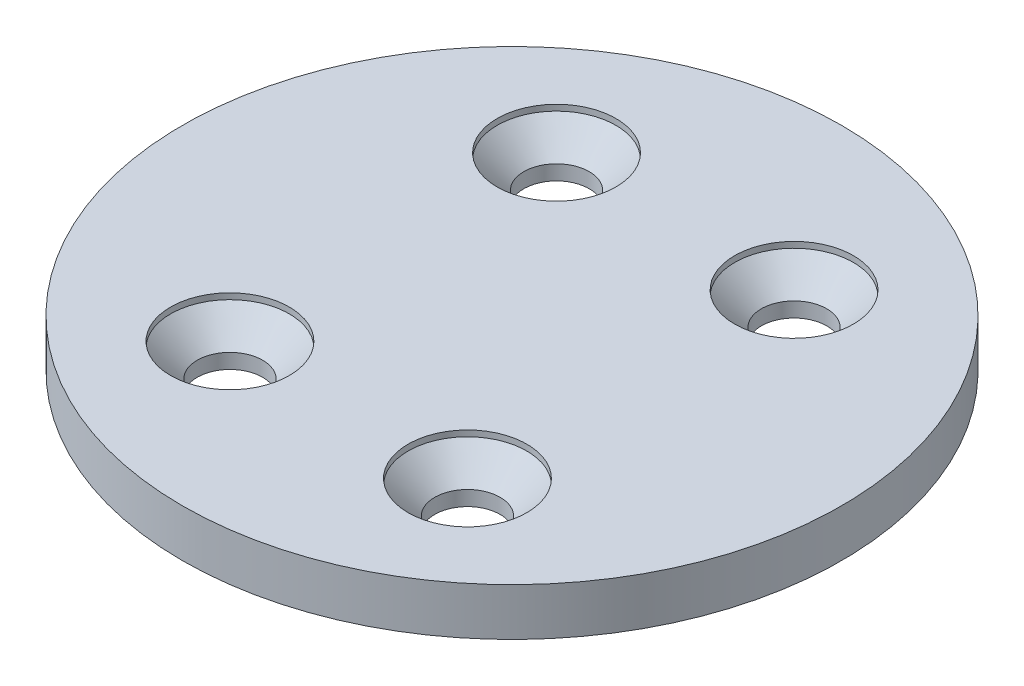
ISO-10303-21;
HEADER;
FILE_DESCRIPTION(('STEP AP214'),'2;1');
FILE_NAME('part.step','',(''),(''),'','','');
FILE_SCHEMA(('AUTOMOTIVE_DESIGN { 1 0 10303 214 1 1 1 1 }'));
ENDSEC;
DATA;
#1=APPLICATION_CONTEXT('core data for automotive mechanical design processes');
#2=APPLICATION_PROTOCOL_DEFINITION('international standard','automotive_design',2000,#1);
#3=PRODUCT_CONTEXT('',#1,'mechanical');
#4=PRODUCT('Part','Part','',(#3));
#5=PRODUCT_RELATED_PRODUCT_CATEGORY('part','',(#4));
#6=PRODUCT_DEFINITION_FORMATION('','',#4);
#7=PRODUCT_DEFINITION_CONTEXT('part definition',#1,'design');
#8=PRODUCT_DEFINITION('design','',#6,#7);
#9=PRODUCT_DEFINITION_SHAPE('','',#8);
#10=(LENGTH_UNIT() NAMED_UNIT(*) SI_UNIT(.MILLI.,.METRE.));
#11=(NAMED_UNIT(*) PLANE_ANGLE_UNIT() SI_UNIT($,.RADIAN.));
#12=(NAMED_UNIT(*) SI_UNIT($,.STERADIAN.) SOLID_ANGLE_UNIT());
#13=UNCERTAINTY_MEASURE_WITH_UNIT(LENGTH_MEASURE(1.E-05),#10,'distance_accuracy_value','');
#14=(GEOMETRIC_REPRESENTATION_CONTEXT(3) GLOBAL_UNCERTAINTY_ASSIGNED_CONTEXT((#13)) GLOBAL_UNIT_ASSIGNED_CONTEXT((#10,
#11,#12)) REPRESENTATION_CONTEXT('',''));
#15=CARTESIAN_POINT('',(0.,0.,0.));
#16=DIRECTION('',(0.,0.,1.));
#17=DIRECTION('',(1.,0.,0.));
#18=AXIS2_PLACEMENT_3D('',#15,#16,#17);
#19=CARTESIAN_POINT('',(10.,4.,-13.75));
#20=DIRECTION('',(0.,-1.,0.));
#21=DIRECTION('',(0.,0.,-1.));
#22=AXIS2_PLACEMENT_3D('',#19,#20,#21);
#23=CYLINDRICAL_SURFACE('',#22,2.75);
#24=CARTESIAN_POINT('',(10.,0.,-13.75));
#25=DIRECTION('',(0.,1.,0.));
#26=DIRECTION('',(0.,0.,1.));
#27=AXIS2_PLACEMENT_3D('',#24,#25,#26);
#28=CIRCLE('',#27,2.75);
#29=CARTESIAN_POINT('',(10.,0.,-11.));
#30=VERTEX_POINT('',#29);
#31=EDGE_CURVE('E175',#30,#30,#28,.T.);
#32=ORIENTED_EDGE('',*,*,#31,.F.);
#33=EDGE_LOOP('',(#32));
#34=FACE_BOUND('',#33,.T.);
#35=CARTESIAN_POINT('',(10.,1.25,-13.75));
#36=DIRECTION('',(0.,1.,0.));
#37=DIRECTION('',(0.,0.,1.));
#38=AXIS2_PLACEMENT_3D('',#35,#36,#37);
#39=CIRCLE('',#38,2.75);
#40=CARTESIAN_POINT('',(10.,1.25,-11.));
#41=VERTEX_POINT('',#40);
#42=EDGE_CURVE('E104',#41,#41,#39,.T.);
#43=ORIENTED_EDGE('',*,*,#42,.T.);
#44=EDGE_LOOP('',(#43));
#45=FACE_BOUND('',#44,.T.);
#46=ADVANCED_FACE('F41',(#34,#45),#23,.F.);
#47=CARTESIAN_POINT('',(10.,4.,13.75));
#48=DIRECTION('',(0.,-1.,0.));
#49=DIRECTION('',(0.,0.,-1.));
#50=AXIS2_PLACEMENT_3D('',#47,#48,#49);
#51=CYLINDRICAL_SURFACE('',#50,2.74999999999999);
#52=CARTESIAN_POINT('',(10.,0.,13.75));
#53=DIRECTION('',(0.,1.,0.));
#54=DIRECTION('',(0.,0.,1.));
#55=AXIS2_PLACEMENT_3D('',#52,#53,#54);
#56=CIRCLE('',#55,2.74999999999999);
#57=CARTESIAN_POINT('',(10.,0.,16.5));
#58=VERTEX_POINT('',#57);
#59=EDGE_CURVE('E57',#58,#58,#56,.T.);
#60=ORIENTED_EDGE('',*,*,#59,.F.);
#61=EDGE_LOOP('',(#60));
#62=FACE_BOUND('',#61,.T.);
#63=CARTESIAN_POINT('',(10.,1.25,13.75));
#64=DIRECTION('',(0.,1.,0.));
#65=DIRECTION('',(0.,0.,1.));
#66=AXIS2_PLACEMENT_3D('',#63,#64,#65);
#67=CIRCLE('',#66,2.75);
#68=CARTESIAN_POINT('',(10.,1.25,16.5));
#69=VERTEX_POINT('',#68);
#70=EDGE_CURVE('E92',#69,#69,#67,.T.);
#71=ORIENTED_EDGE('',*,*,#70,.T.);
#72=EDGE_LOOP('',(#71));
#73=FACE_BOUND('',#72,.T.);
#74=ADVANCED_FACE('F148',(#62,#73),#51,.F.);
#75=CARTESIAN_POINT('',(-10.,4.,-13.75));
#76=DIRECTION('',(0.,-1.,0.));
#77=DIRECTION('',(0.,0.,-1.));
#78=AXIS2_PLACEMENT_3D('',#75,#76,#77);
#79=CYLINDRICAL_SURFACE('',#78,2.75000000000001);
#80=CARTESIAN_POINT('',(-10.,0.,-13.75));
#81=DIRECTION('',(0.,1.,0.));
#82=DIRECTION('',(0.,0.,1.));
#83=AXIS2_PLACEMENT_3D('',#80,#81,#82);
#84=CIRCLE('',#83,2.75000000000001);
#85=CARTESIAN_POINT('',(-10.,0.,-11.));
#86=VERTEX_POINT('',#85);
#87=EDGE_CURVE('E64',#86,#86,#84,.T.);
#88=ORIENTED_EDGE('',*,*,#87,.F.);
#89=EDGE_LOOP('',(#88));
#90=FACE_BOUND('',#89,.T.);
#91=CARTESIAN_POINT('',(-10.,1.25,-13.75));
#92=DIRECTION('',(0.,1.,0.));
#93=DIRECTION('',(0.,0.,1.));
#94=AXIS2_PLACEMENT_3D('',#91,#92,#93);
#95=CIRCLE('',#94,2.75);
#96=CARTESIAN_POINT('',(-10.,1.25,-11.));
#97=VERTEX_POINT('',#96);
#98=EDGE_CURVE('E61',#97,#97,#95,.T.);
#99=ORIENTED_EDGE('',*,*,#98,.T.);
#100=EDGE_LOOP('',(#99));
#101=FACE_BOUND('',#100,.T.);
#102=ADVANCED_FACE('F43',(#90,#101),#79,.F.);
#103=CARTESIAN_POINT('',(-10.,4.,13.75));
#104=DIRECTION('',(0.,-1.,0.));
#105=DIRECTION('',(0.,0.,-1.));
#106=AXIS2_PLACEMENT_3D('',#103,#104,#105);
#107=CYLINDRICAL_SURFACE('',#106,2.75);
#108=CARTESIAN_POINT('',(-10.,1.25,13.75));
#109=DIRECTION('',(0.,1.,0.));
#110=DIRECTION('',(0.,0.,1.));
#111=AXIS2_PLACEMENT_3D('',#108,#109,#110);
#112=CIRCLE('',#111,2.75);
#113=CARTESIAN_POINT('',(-10.,1.25,16.5));
#114=VERTEX_POINT('',#113);
#115=EDGE_CURVE('E79',#114,#114,#112,.T.);
#116=ORIENTED_EDGE('',*,*,#115,.T.);
#117=EDGE_LOOP('',(#116));
#118=FACE_BOUND('',#117,.T.);
#119=CARTESIAN_POINT('',(-10.,0.,13.75));
#120=DIRECTION('',(0.,1.,0.));
#121=DIRECTION('',(0.,0.,1.));
#122=AXIS2_PLACEMENT_3D('',#119,#120,#121);
#123=CIRCLE('',#122,2.75);
#124=CARTESIAN_POINT('',(-10.,0.,16.5));
#125=VERTEX_POINT('',#124);
#126=EDGE_CURVE('E172',#125,#125,#123,.T.);
#127=ORIENTED_EDGE('',*,*,#126,.F.);
#128=EDGE_LOOP('',(#127));
#129=FACE_BOUND('',#128,.T.);
#130=ADVANCED_FACE('F159',(#118,#129),#107,.F.);
#131=CARTESIAN_POINT('',(0.,4.,0.));
#132=DIRECTION('',(0.,-1.,0.));
#133=DIRECTION('',(0.,0.,-1.));
#134=AXIS2_PLACEMENT_3D('',#131,#132,#133);
#135=CYLINDRICAL_SURFACE('',#134,27.75);
#136=CARTESIAN_POINT('',(0.,4.,0.));
#137=DIRECTION('',(0.,1.,0.));
#138=DIRECTION('',(0.,0.,1.));
#139=AXIS2_PLACEMENT_3D('',#136,#137,#138);
#140=CIRCLE('',#139,27.75);
#141=CARTESIAN_POINT('',(0.,4.,27.75));
#142=VERTEX_POINT('',#141);
#143=EDGE_CURVE('E11',#142,#142,#140,.T.);
#144=ORIENTED_EDGE('',*,*,#143,.F.);
#145=EDGE_LOOP('',(#144));
#146=FACE_BOUND('',#145,.T.);
#147=CARTESIAN_POINT('',(0.,0.,0.));
#148=DIRECTION('',(0.,1.,0.));
#149=DIRECTION('',(0.,0.,1.));
#150=AXIS2_PLACEMENT_3D('',#147,#148,#149);
#151=CIRCLE('',#150,27.75);
#152=CARTESIAN_POINT('',(0.,0.,27.75));
#153=VERTEX_POINT('',#152);
#154=EDGE_CURVE('E45',#153,#153,#151,.T.);
#155=ORIENTED_EDGE('',*,*,#154,.T.);
#156=EDGE_LOOP('',(#155));
#157=FACE_BOUND('',#156,.T.);
#158=ADVANCED_FACE('F123',(#146,#157),#135,.T.);
#159=CARTESIAN_POINT('',(0.,4.,0.));
#160=DIRECTION('',(0.,1.,0.));
#161=DIRECTION('',(0.,0.,1.));
#162=AXIS2_PLACEMENT_3D('',#159,#160,#161);
#163=PLANE('',#162);
#164=CARTESIAN_POINT('',(10.,4.,-13.75));
#165=DIRECTION('',(0.,1.,0.));
#166=DIRECTION('',(0.,0.,1.));
#167=AXIS2_PLACEMENT_3D('',#164,#165,#166);
#168=CIRCLE('',#167,5.);
#169=CARTESIAN_POINT('',(10.,4.,-8.75));
#170=VERTEX_POINT('',#169);
#171=EDGE_CURVE('E112',#170,#170,#168,.T.);
#172=ORIENTED_EDGE('',*,*,#171,.F.);
#173=EDGE_LOOP('',(#172));
#174=FACE_BOUND('',#173,.T.);
#175=CARTESIAN_POINT('',(10.,4.,13.75));
#176=DIRECTION('',(0.,1.,0.));
#177=DIRECTION('',(0.,0.,1.));
#178=AXIS2_PLACEMENT_3D('',#175,#176,#177);
#179=CIRCLE('',#178,5.);
#180=CARTESIAN_POINT('',(10.,4.,18.75));
#181=VERTEX_POINT('',#180);
#182=EDGE_CURVE('E100',#181,#181,#179,.T.);
#183=ORIENTED_EDGE('',*,*,#182,.F.);
#184=EDGE_LOOP('',(#183));
#185=FACE_BOUND('',#184,.T.);
#186=CARTESIAN_POINT('',(-10.,4.,13.75));
#187=DIRECTION('',(0.,1.,0.));
#188=DIRECTION('',(0.,0.,1.));
#189=AXIS2_PLACEMENT_3D('',#186,#187,#188);
#190=CIRCLE('',#189,5.);
#191=CARTESIAN_POINT('',(-10.,4.,18.75));
#192=VERTEX_POINT('',#191);
#193=EDGE_CURVE('E88',#192,#192,#190,.T.);
#194=ORIENTED_EDGE('',*,*,#193,.F.);
#195=EDGE_LOOP('',(#194));
#196=FACE_BOUND('',#195,.T.);
#197=CARTESIAN_POINT('',(-10.,4.,-13.75));
#198=DIRECTION('',(0.,1.,0.));
#199=DIRECTION('',(0.,0.,1.));
#200=AXIS2_PLACEMENT_3D('',#197,#198,#199);
#201=CIRCLE('',#200,5.);
#202=CARTESIAN_POINT('',(-10.,4.,-8.74999999999999));
#203=VERTEX_POINT('',#202);
#204=EDGE_CURVE('E74',#203,#203,#201,.T.);
#205=ORIENTED_EDGE('',*,*,#204,.F.);
#206=EDGE_LOOP('',(#205));
#207=FACE_BOUND('',#206,.T.);
#208=ORIENTED_EDGE('',*,*,#143,.T.);
#209=EDGE_LOOP('',(#208));
#210=FACE_BOUND('',#209,.T.);
#211=ADVANCED_FACE('F119',(#174,#185,#196,#207,#210),#163,.T.);
#212=CARTESIAN_POINT('',(0.,0.,0.));
#213=DIRECTION('',(0.,1.,0.));
#214=DIRECTION('',(0.,0.,1.));
#215=AXIS2_PLACEMENT_3D('',#212,#213,#214);
#216=PLANE('',#215);
#217=ORIENTED_EDGE('',*,*,#87,.T.);
#218=EDGE_LOOP('',(#217));
#219=FACE_BOUND('',#218,.T.);
#220=ORIENTED_EDGE('',*,*,#126,.T.);
#221=EDGE_LOOP('',(#220));
#222=FACE_BOUND('',#221,.T.);
#223=ORIENTED_EDGE('',*,*,#31,.T.);
#224=EDGE_LOOP('',(#223));
#225=FACE_BOUND('',#224,.T.);
#226=ORIENTED_EDGE('',*,*,#59,.T.);
#227=EDGE_LOOP('',(#226));
#228=FACE_BOUND('',#227,.T.);
#229=ORIENTED_EDGE('',*,*,#154,.F.);
#230=EDGE_LOOP('',(#229));
#231=FACE_BOUND('',#230,.T.);
#232=ADVANCED_FACE('F122',(#219,#222,#225,#228,#231),#216,.F.);
#233=CARTESIAN_POINT('',(-10.,3.5,-13.75));
#234=DIRECTION('',(0.,1.,0.));
#235=DIRECTION('',(0.,0.,1.));
#236=AXIS2_PLACEMENT_3D('',#233,#234,#235);
#237=CONICAL_SURFACE('',#236,5.,0.785398163397449);
#238=ORIENTED_EDGE('',*,*,#98,.F.);
#239=EDGE_LOOP('',(#238));
#240=FACE_BOUND('',#239,.T.);
#241=CARTESIAN_POINT('',(-10.,3.5,-13.75));
#242=DIRECTION('',(0.,1.,0.));
#243=DIRECTION('',(0.,0.,1.));
#244=AXIS2_PLACEMENT_3D('',#241,#242,#243);
#245=CIRCLE('',#244,5.);
#246=CARTESIAN_POINT('',(-10.,3.5,-8.74999999999999));
#247=VERTEX_POINT('',#246);
#248=EDGE_CURVE('E70',#247,#247,#245,.T.);
#249=ORIENTED_EDGE('',*,*,#248,.T.);
#250=EDGE_LOOP('',(#249));
#251=FACE_BOUND('',#250,.T.);
#252=ADVANCED_FACE('F134',(#240,#251),#237,.F.);
#253=CARTESIAN_POINT('',(-10.,4.,-13.75));
#254=DIRECTION('',(0.,1.,0.));
#255=DIRECTION('',(0.,0.,1.));
#256=AXIS2_PLACEMENT_3D('',#253,#254,#255);
#257=CYLINDRICAL_SURFACE('',#256,5.);
#258=ORIENTED_EDGE('',*,*,#248,.F.);
#259=EDGE_LOOP('',(#258));
#260=FACE_BOUND('',#259,.T.);
#261=ORIENTED_EDGE('',*,*,#204,.T.);
#262=EDGE_LOOP('',(#261));
#263=FACE_BOUND('',#262,.T.);
#264=ADVANCED_FACE('F131',(#260,#263),#257,.F.);
#265=CARTESIAN_POINT('',(-10.,3.5,13.75));
#266=DIRECTION('',(0.,1.,0.));
#267=DIRECTION('',(0.,0.,1.));
#268=AXIS2_PLACEMENT_3D('',#265,#266,#267);
#269=CONICAL_SURFACE('',#268,5.,0.785398163397449);
#270=ORIENTED_EDGE('',*,*,#115,.F.);
#271=EDGE_LOOP('',(#270));
#272=FACE_BOUND('',#271,.T.);
#273=CARTESIAN_POINT('',(-10.,3.5,13.75));
#274=DIRECTION('',(0.,1.,0.));
#275=DIRECTION('',(0.,0.,1.));
#276=AXIS2_PLACEMENT_3D('',#273,#274,#275);
#277=CIRCLE('',#276,5.);
#278=CARTESIAN_POINT('',(-10.,3.5,18.75));
#279=VERTEX_POINT('',#278);
#280=EDGE_CURVE('E84',#279,#279,#277,.T.);
#281=ORIENTED_EDGE('',*,*,#280,.T.);
#282=EDGE_LOOP('',(#281));
#283=FACE_BOUND('',#282,.T.);
#284=ADVANCED_FACE('F133',(#272,#283),#269,.F.);
#285=CARTESIAN_POINT('',(-10.,4.,13.75));
#286=DIRECTION('',(0.,1.,0.));
#287=DIRECTION('',(0.,0.,1.));
#288=AXIS2_PLACEMENT_3D('',#285,#286,#287);
#289=CYLINDRICAL_SURFACE('',#288,5.);
#290=ORIENTED_EDGE('',*,*,#280,.F.);
#291=EDGE_LOOP('',(#290));
#292=FACE_BOUND('',#291,.T.);
#293=ORIENTED_EDGE('',*,*,#193,.T.);
#294=EDGE_LOOP('',(#293));
#295=FACE_BOUND('',#294,.T.);
#296=ADVANCED_FACE('F141',(#292,#295),#289,.F.);
#297=CARTESIAN_POINT('',(10.,3.5,13.75));
#298=DIRECTION('',(0.,1.,0.));
#299=DIRECTION('',(0.,0.,1.));
#300=AXIS2_PLACEMENT_3D('',#297,#298,#299);
#301=CONICAL_SURFACE('',#300,5.,0.785398163397448);
#302=ORIENTED_EDGE('',*,*,#70,.F.);
#303=EDGE_LOOP('',(#302));
#304=FACE_BOUND('',#303,.T.);
#305=CARTESIAN_POINT('',(10.,3.5,13.75));
#306=DIRECTION('',(0.,1.,0.));
#307=DIRECTION('',(0.,0.,1.));
#308=AXIS2_PLACEMENT_3D('',#305,#306,#307);
#309=CIRCLE('',#308,5.);
#310=CARTESIAN_POINT('',(10.,3.5,18.75));
#311=VERTEX_POINT('',#310);
#312=EDGE_CURVE('E96',#311,#311,#309,.T.);
#313=ORIENTED_EDGE('',*,*,#312,.T.);
#314=EDGE_LOOP('',(#313));
#315=FACE_BOUND('',#314,.T.);
#316=ADVANCED_FACE('F189',(#304,#315),#301,.F.);
#317=CARTESIAN_POINT('',(10.,4.,13.75));
#318=DIRECTION('',(0.,1.,0.));
#319=DIRECTION('',(0.,0.,1.));
#320=AXIS2_PLACEMENT_3D('',#317,#318,#319);
#321=CYLINDRICAL_SURFACE('',#320,5.);
#322=ORIENTED_EDGE('',*,*,#312,.F.);
#323=EDGE_LOOP('',(#322));
#324=FACE_BOUND('',#323,.T.);
#325=ORIENTED_EDGE('',*,*,#182,.T.);
#326=EDGE_LOOP('',(#325));
#327=FACE_BOUND('',#326,.T.);
#328=ADVANCED_FACE('F192',(#324,#327),#321,.F.);
#329=CARTESIAN_POINT('',(10.,3.5,-13.75));
#330=DIRECTION('',(0.,1.,0.));
#331=DIRECTION('',(0.,0.,1.));
#332=AXIS2_PLACEMENT_3D('',#329,#330,#331);
#333=CONICAL_SURFACE('',#332,5.,0.785398163397448);
#334=ORIENTED_EDGE('',*,*,#42,.F.);
#335=EDGE_LOOP('',(#334));
#336=FACE_BOUND('',#335,.T.);
#337=CARTESIAN_POINT('',(10.,3.5,-13.75));
#338=DIRECTION('',(0.,1.,0.));
#339=DIRECTION('',(0.,0.,1.));
#340=AXIS2_PLACEMENT_3D('',#337,#338,#339);
#341=CIRCLE('',#340,5.);
#342=CARTESIAN_POINT('',(10.,3.5,-8.75));
#343=VERTEX_POINT('',#342);
#344=EDGE_CURVE('E108',#343,#343,#341,.T.);
#345=ORIENTED_EDGE('',*,*,#344,.T.);
#346=EDGE_LOOP('',(#345));
#347=FACE_BOUND('',#346,.T.);
#348=ADVANCED_FACE('F198',(#336,#347),#333,.F.);
#349=CARTESIAN_POINT('',(10.,4.,-13.75));
#350=DIRECTION('',(0.,1.,0.));
#351=DIRECTION('',(0.,0.,1.));
#352=AXIS2_PLACEMENT_3D('',#349,#350,#351);
#353=CYLINDRICAL_SURFACE('',#352,5.);
#354=ORIENTED_EDGE('',*,*,#344,.F.);
#355=EDGE_LOOP('',(#354));
#356=FACE_BOUND('',#355,.T.);
#357=ORIENTED_EDGE('',*,*,#171,.T.);
#358=EDGE_LOOP('',(#357));
#359=FACE_BOUND('',#358,.T.);
#360=ADVANCED_FACE('F117',(#356,#359),#353,.F.);
#361=CLOSED_SHELL('',(#46,#74,#102,#130,#158,#211,#232,#252,#264,#284,#296,#316,#328,#348,#360));
#362=MANIFOLD_SOLID_BREP('B2',#361);
#363=ADVANCED_BREP_SHAPE_REPRESENTATION('',(#18,#362),#14);
#364=SHAPE_DEFINITION_REPRESENTATION(#9,#363);
ENDSEC;
END-ISO-10303-21;
